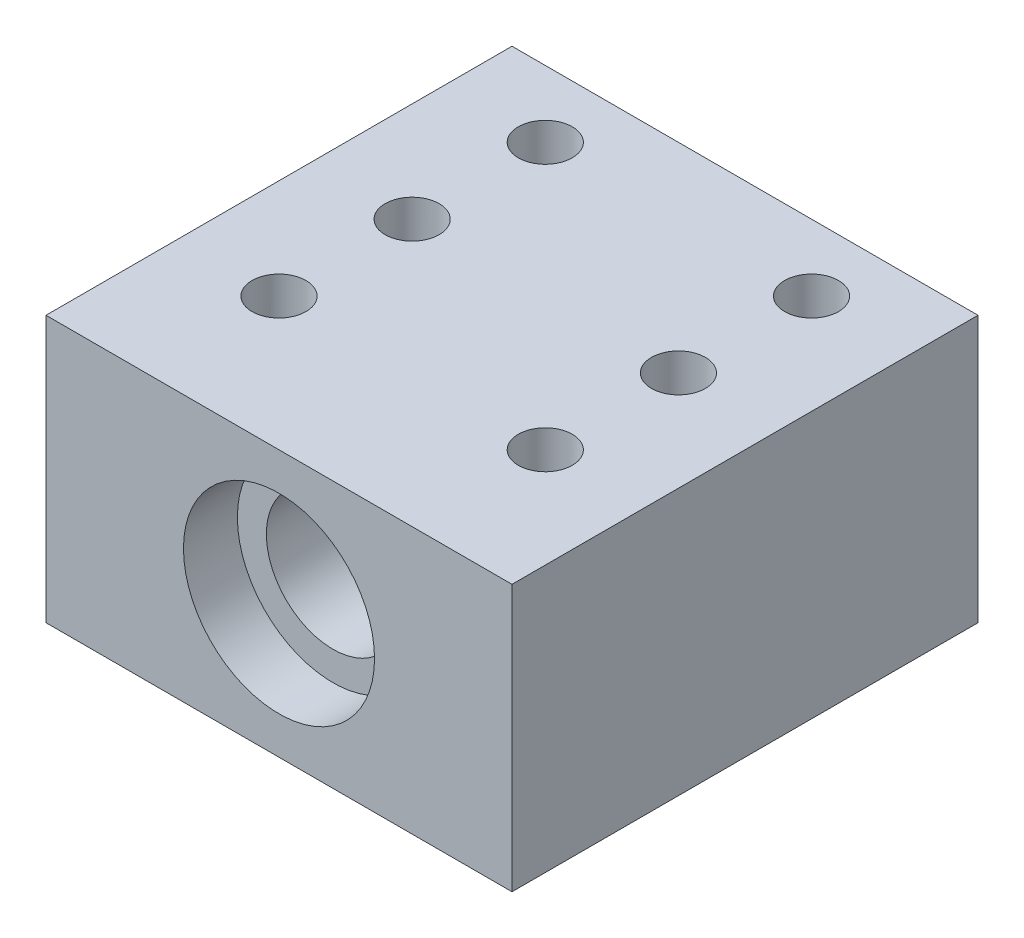
ISO-10303-21;
HEADER;
FILE_DESCRIPTION(('STEP AP214'),'2;1');
FILE_NAME('part.step','',(''),(''),'','','');
FILE_SCHEMA(('AUTOMOTIVE_DESIGN { 1 0 10303 214 1 1 1 1 }'));
ENDSEC;
DATA;
#1=APPLICATION_CONTEXT('core data for automotive mechanical design processes');
#2=APPLICATION_PROTOCOL_DEFINITION('international standard','automotive_design',2000,#1);
#3=PRODUCT_CONTEXT('',#1,'mechanical');
#4=PRODUCT('Part','Part','',(#3));
#5=PRODUCT_RELATED_PRODUCT_CATEGORY('part','',(#4));
#6=PRODUCT_DEFINITION_FORMATION('','',#4);
#7=PRODUCT_DEFINITION_CONTEXT('part definition',#1,'design');
#8=PRODUCT_DEFINITION('design','',#6,#7);
#9=PRODUCT_DEFINITION_SHAPE('','',#8);
#10=(LENGTH_UNIT() NAMED_UNIT(*) SI_UNIT(.MILLI.,.METRE.));
#11=(NAMED_UNIT(*) PLANE_ANGLE_UNIT() SI_UNIT($,.RADIAN.));
#12=(NAMED_UNIT(*) SI_UNIT($,.STERADIAN.) SOLID_ANGLE_UNIT());
#13=UNCERTAINTY_MEASURE_WITH_UNIT(LENGTH_MEASURE(1.E-05),#10,'distance_accuracy_value','');
#14=(GEOMETRIC_REPRESENTATION_CONTEXT(3) GLOBAL_UNCERTAINTY_ASSIGNED_CONTEXT((#13)) GLOBAL_UNIT_ASSIGNED_CONTEXT((#10,
#11,#12)) REPRESENTATION_CONTEXT('',''));
#15=CARTESIAN_POINT('',(0.,0.,0.));
#16=DIRECTION('',(0.,0.,1.));
#17=DIRECTION('',(1.,0.,0.));
#18=AXIS2_PLACEMENT_3D('',#15,#16,#17);
#19=CARTESIAN_POINT('',(0.,0.,40.));
#20=DIRECTION('',(0.,0.,-1.));
#21=DIRECTION('',(-1.,0.,0.));
#22=AXIS2_PLACEMENT_3D('',#19,#20,#21);
#23=CYLINDRICAL_SURFACE('',#22,10.);
#24=CARTESIAN_POINT('',(0.,0.,-21.9));
#25=DIRECTION('',(0.,0.,1.));
#26=DIRECTION('',(1.,0.,0.));
#27=AXIS2_PLACEMENT_3D('',#24,#25,#26);
#28=CIRCLE('',#27,10.);
#29=CARTESIAN_POINT('',(10.,0.,-21.9));
#30=VERTEX_POINT('',#29);
#31=EDGE_CURVE('E38',#30,#30,#28,.T.);
#32=ORIENTED_EDGE('',*,*,#31,.F.);
#33=EDGE_LOOP('',(#32));
#34=FACE_BOUND('',#33,.T.);
#35=CARTESIAN_POINT('',(0.,0.,31.9));
#36=DIRECTION('',(0.,0.,1.));
#37=DIRECTION('',(1.,0.,0.));
#38=AXIS2_PLACEMENT_3D('',#35,#36,#37);
#39=CIRCLE('',#38,10.);
#40=CARTESIAN_POINT('',(10.,0.,31.9));
#41=VERTEX_POINT('',#40);
#42=EDGE_CURVE('E118',#41,#41,#39,.T.);
#43=ORIENTED_EDGE('',*,*,#42,.T.);
#44=EDGE_LOOP('',(#43));
#45=FACE_BOUND('',#44,.T.);
#46=ADVANCED_FACE('F34',(#34,#45),#23,.F.);
#47=CARTESIAN_POINT('',(0.,0.,40.));
#48=DIRECTION('',(0.,0.,1.));
#49=DIRECTION('',(1.,0.,0.));
#50=AXIS2_PLACEMENT_3D('',#47,#48,#49);
#51=PLANE('',#50);
#52=CARTESIAN_POINT('',(0.,0.,40.));
#53=DIRECTION('',(0.,0.,1.));
#54=DIRECTION('',(1.,0.,0.));
#55=AXIS2_PLACEMENT_3D('',#52,#53,#54);
#56=CIRCLE('',#55,14.35);
#57=CARTESIAN_POINT('',(14.35,0.,40.));
#58=VERTEX_POINT('',#57);
#59=EDGE_CURVE('E141',#58,#58,#56,.T.);
#60=ORIENTED_EDGE('',*,*,#59,.F.);
#61=EDGE_LOOP('',(#60));
#62=FACE_BOUND('',#61,.T.);
#63=DIRECTION('',(0.,-1.,0.));
#64=VECTOR('',#63,1.);
#65=CARTESIAN_POINT('',(-35.,20.,40.));
#66=LINE('',#65,#64);
#67=CARTESIAN_POINT('',(-35.,20.,40.));
#68=VERTEX_POINT('',#67);
#69=CARTESIAN_POINT('',(-35.,-20.,40.));
#70=VERTEX_POINT('',#69);
#71=EDGE_CURVE('E105',#68,#70,#66,.T.);
#72=ORIENTED_EDGE('',*,*,#71,.T.);
#73=DIRECTION('',(1.,0.,0.));
#74=VECTOR('',#73,1.);
#75=CARTESIAN_POINT('',(-35.,-20.,40.));
#76=LINE('',#75,#74);
#77=CARTESIAN_POINT('',(35.,-20.,40.));
#78=VERTEX_POINT('',#77);
#79=EDGE_CURVE('E80',#70,#78,#76,.T.);
#80=ORIENTED_EDGE('',*,*,#79,.T.);
#81=DIRECTION('',(0.,1.,0.));
#82=VECTOR('',#81,1.);
#83=CARTESIAN_POINT('',(35.,20.,40.));
#84=LINE('',#83,#82);
#85=CARTESIAN_POINT('',(35.,20.,40.));
#86=VERTEX_POINT('',#85);
#87=EDGE_CURVE('E56',#78,#86,#84,.T.);
#88=ORIENTED_EDGE('',*,*,#87,.T.);
#89=DIRECTION('',(-1.,0.,0.));
#90=VECTOR('',#89,1.);
#91=CARTESIAN_POINT('',(-35.,20.,40.));
#92=LINE('',#91,#90);
#93=EDGE_CURVE('E51',#86,#68,#92,.T.);
#94=ORIENTED_EDGE('',*,*,#93,.T.);
#95=EDGE_LOOP('',(#72,#80,#88,#94));
#96=FACE_BOUND('',#95,.T.);
#97=ADVANCED_FACE('F192',(#62,#96),#51,.T.);
#98=CARTESIAN_POINT('',(-35.,20.,40.));
#99=DIRECTION('',(1.,0.,0.));
#100=DIRECTION('',(0.,1.,0.));
#101=AXIS2_PLACEMENT_3D('',#98,#99,#100);
#102=PLANE('',#101);
#103=DIRECTION('',(0.,0.,-1.));
#104=VECTOR('',#103,1.);
#105=CARTESIAN_POINT('',(-35.,20.,40.));
#106=LINE('',#105,#104);
#107=CARTESIAN_POINT('',(-35.,20.,-30.));
#108=VERTEX_POINT('',#107);
#109=EDGE_CURVE('E94',#68,#108,#106,.T.);
#110=ORIENTED_EDGE('',*,*,#109,.T.);
#111=DIRECTION('',(0.,-1.,0.));
#112=VECTOR('',#111,1.);
#113=CARTESIAN_POINT('',(-35.,20.,-30.));
#114=LINE('',#113,#112);
#115=CARTESIAN_POINT('',(-35.,-20.,-30.));
#116=VERTEX_POINT('',#115);
#117=EDGE_CURVE('E89',#108,#116,#114,.T.);
#118=ORIENTED_EDGE('',*,*,#117,.T.);
#119=DIRECTION('',(0.,0.,-1.));
#120=VECTOR('',#119,1.);
#121=CARTESIAN_POINT('',(-35.,-20.,40.));
#122=LINE('',#121,#120);
#123=EDGE_CURVE('E11',#70,#116,#122,.T.);
#124=ORIENTED_EDGE('',*,*,#123,.F.);
#125=ORIENTED_EDGE('',*,*,#71,.F.);
#126=EDGE_LOOP('',(#110,#118,#124,#125));
#127=FACE_BOUND('',#126,.T.);
#128=ADVANCED_FACE('F36',(#127),#102,.F.);
#129=CARTESIAN_POINT('',(-35.,-20.,40.));
#130=DIRECTION('',(0.,1.,0.));
#131=DIRECTION('',(-1.,0.,0.));
#132=AXIS2_PLACEMENT_3D('',#129,#130,#131);
#133=PLANE('',#132);
#134=CARTESIAN_POINT('',(-20.,-20.,0.));
#135=DIRECTION('',(0.,1.,0.));
#136=DIRECTION('',(-1.,0.,0.));
#137=AXIS2_PLACEMENT_3D('',#134,#135,#136);
#138=CIRCLE('',#137,4.05);
#139=CARTESIAN_POINT('',(-24.05,-20.,0.));
#140=VERTEX_POINT('',#139);
#141=EDGE_CURVE('E95',#140,#140,#138,.F.);
#142=ORIENTED_EDGE('',*,*,#141,.F.);
#143=EDGE_LOOP('',(#142));
#144=FACE_BOUND('',#143,.T.);
#145=CARTESIAN_POINT('',(20.,-20.,20.));
#146=DIRECTION('',(0.,1.,0.));
#147=DIRECTION('',(-1.,0.,0.));
#148=AXIS2_PLACEMENT_3D('',#145,#146,#147);
#149=CIRCLE('',#148,4.05);
#150=CARTESIAN_POINT('',(15.95,-20.,20.));
#151=VERTEX_POINT('',#150);
#152=EDGE_CURVE('E134',#151,#151,#149,.F.);
#153=ORIENTED_EDGE('',*,*,#152,.F.);
#154=EDGE_LOOP('',(#153));
#155=FACE_BOUND('',#154,.T.);
#156=CARTESIAN_POINT('',(-20.,-20.,20.));
#157=DIRECTION('',(0.,1.,0.));
#158=DIRECTION('',(-1.,0.,0.));
#159=AXIS2_PLACEMENT_3D('',#156,#157,#158);
#160=CIRCLE('',#159,4.05);
#161=CARTESIAN_POINT('',(-24.05,-20.,20.));
#162=VERTEX_POINT('',#161);
#163=EDGE_CURVE('E130',#162,#162,#160,.F.);
#164=ORIENTED_EDGE('',*,*,#163,.F.);
#165=EDGE_LOOP('',(#164));
#166=FACE_BOUND('',#165,.T.);
#167=CARTESIAN_POINT('',(20.,-20.,-20.));
#168=DIRECTION('',(0.,1.,0.));
#169=DIRECTION('',(-1.,0.,0.));
#170=AXIS2_PLACEMENT_3D('',#167,#168,#169);
#171=CIRCLE('',#170,4.05);
#172=CARTESIAN_POINT('',(15.95,-20.,-20.));
#173=VERTEX_POINT('',#172);
#174=EDGE_CURVE('E126',#173,#173,#171,.F.);
#175=ORIENTED_EDGE('',*,*,#174,.F.);
#176=EDGE_LOOP('',(#175));
#177=FACE_BOUND('',#176,.T.);
#178=CARTESIAN_POINT('',(20.,-20.,0.));
#179=DIRECTION('',(0.,1.,0.));
#180=DIRECTION('',(-1.,0.,0.));
#181=AXIS2_PLACEMENT_3D('',#178,#179,#180);
#182=CIRCLE('',#181,4.05);
#183=CARTESIAN_POINT('',(15.95,-20.,0.));
#184=VERTEX_POINT('',#183);
#185=EDGE_CURVE('E122',#184,#184,#182,.F.);
#186=ORIENTED_EDGE('',*,*,#185,.F.);
#187=EDGE_LOOP('',(#186));
#188=FACE_BOUND('',#187,.T.);
#189=CARTESIAN_POINT('',(-20.,-20.,-20.));
#190=DIRECTION('',(0.,1.,0.));
#191=DIRECTION('',(-1.,0.,0.));
#192=AXIS2_PLACEMENT_3D('',#189,#190,#191);
#193=CIRCLE('',#192,4.05);
#194=CARTESIAN_POINT('',(-24.05,-20.,-20.));
#195=VERTEX_POINT('',#194);
#196=EDGE_CURVE('E117',#195,#195,#193,.F.);
#197=ORIENTED_EDGE('',*,*,#196,.F.);
#198=EDGE_LOOP('',(#197));
#199=FACE_BOUND('',#198,.T.);
#200=ORIENTED_EDGE('',*,*,#123,.T.);
#201=DIRECTION('',(1.,0.,0.));
#202=VECTOR('',#201,1.);
#203=CARTESIAN_POINT('',(-35.,-20.,-30.));
#204=LINE('',#203,#202);
#205=CARTESIAN_POINT('',(35.,-20.,-30.));
#206=VERTEX_POINT('',#205);
#207=EDGE_CURVE('E79',#116,#206,#204,.T.);
#208=ORIENTED_EDGE('',*,*,#207,.T.);
#209=DIRECTION('',(0.,0.,-1.));
#210=VECTOR('',#209,1.);
#211=CARTESIAN_POINT('',(35.,-20.,40.));
#212=LINE('',#211,#210);
#213=EDGE_CURVE('E43',#78,#206,#212,.T.);
#214=ORIENTED_EDGE('',*,*,#213,.F.);
#215=ORIENTED_EDGE('',*,*,#79,.F.);
#216=EDGE_LOOP('',(#200,#208,#214,#215));
#217=FACE_BOUND('',#216,.T.);
#218=ADVANCED_FACE('F77',(#144,#155,#166,#177,#188,#199,#217),#133,.F.);
#219=CARTESIAN_POINT('',(35.,20.,40.));
#220=DIRECTION('',(-1.,0.,0.));
#221=DIRECTION('',(0.,-1.,0.));
#222=AXIS2_PLACEMENT_3D('',#219,#220,#221);
#223=PLANE('',#222);
#224=ORIENTED_EDGE('',*,*,#213,.T.);
#225=DIRECTION('',(0.,1.,0.));
#226=VECTOR('',#225,1.);
#227=CARTESIAN_POINT('',(35.,20.,-30.));
#228=LINE('',#227,#226);
#229=CARTESIAN_POINT('',(35.,20.,-30.));
#230=VERTEX_POINT('',#229);
#231=EDGE_CURVE('E92',#206,#230,#228,.T.);
#232=ORIENTED_EDGE('',*,*,#231,.T.);
#233=DIRECTION('',(0.,0.,-1.));
#234=VECTOR('',#233,1.);
#235=CARTESIAN_POINT('',(35.,20.,40.));
#236=LINE('',#235,#234);
#237=EDGE_CURVE('E111',#86,#230,#236,.T.);
#238=ORIENTED_EDGE('',*,*,#237,.F.);
#239=ORIENTED_EDGE('',*,*,#87,.F.);
#240=EDGE_LOOP('',(#224,#232,#238,#239));
#241=FACE_BOUND('',#240,.T.);
#242=ADVANCED_FACE('F165',(#241),#223,.F.);
#243=CARTESIAN_POINT('',(-35.,20.,40.));
#244=DIRECTION('',(0.,-1.,0.));
#245=DIRECTION('',(1.,0.,0.));
#246=AXIS2_PLACEMENT_3D('',#243,#244,#245);
#247=PLANE('',#246);
#248=CARTESIAN_POINT('',(-20.,20.,0.));
#249=DIRECTION('',(0.,-1.,0.));
#250=DIRECTION('',(1.,0.,0.));
#251=AXIS2_PLACEMENT_3D('',#248,#249,#250);
#252=CIRCLE('',#251,4.05);
#253=CARTESIAN_POINT('',(-15.95,20.,0.));
#254=VERTEX_POINT('',#253);
#255=EDGE_CURVE('E98',#254,#254,#252,.F.);
#256=ORIENTED_EDGE('',*,*,#255,.F.);
#257=EDGE_LOOP('',(#256));
#258=FACE_BOUND('',#257,.T.);
#259=CARTESIAN_POINT('',(20.,20.,20.));
#260=DIRECTION('',(0.,-1.,0.));
#261=DIRECTION('',(1.,0.,0.));
#262=AXIS2_PLACEMENT_3D('',#259,#260,#261);
#263=CIRCLE('',#262,4.05);
#264=CARTESIAN_POINT('',(24.05,20.,20.));
#265=VERTEX_POINT('',#264);
#266=EDGE_CURVE('E131',#265,#265,#263,.F.);
#267=ORIENTED_EDGE('',*,*,#266,.F.);
#268=EDGE_LOOP('',(#267));
#269=FACE_BOUND('',#268,.T.);
#270=CARTESIAN_POINT('',(-20.,20.,20.));
#271=DIRECTION('',(0.,-1.,0.));
#272=DIRECTION('',(1.,0.,0.));
#273=AXIS2_PLACEMENT_3D('',#270,#271,#272);
#274=CIRCLE('',#273,4.05);
#275=CARTESIAN_POINT('',(-15.95,20.,20.));
#276=VERTEX_POINT('',#275);
#277=EDGE_CURVE('E127',#276,#276,#274,.F.);
#278=ORIENTED_EDGE('',*,*,#277,.F.);
#279=EDGE_LOOP('',(#278));
#280=FACE_BOUND('',#279,.T.);
#281=CARTESIAN_POINT('',(20.,20.,-20.));
#282=DIRECTION('',(0.,-1.,0.));
#283=DIRECTION('',(1.,0.,0.));
#284=AXIS2_PLACEMENT_3D('',#281,#282,#283);
#285=CIRCLE('',#284,4.05);
#286=CARTESIAN_POINT('',(24.05,20.,-20.));
#287=VERTEX_POINT('',#286);
#288=EDGE_CURVE('E123',#287,#287,#285,.F.);
#289=ORIENTED_EDGE('',*,*,#288,.F.);
#290=EDGE_LOOP('',(#289));
#291=FACE_BOUND('',#290,.T.);
#292=CARTESIAN_POINT('',(20.,20.,0.));
#293=DIRECTION('',(0.,-1.,0.));
#294=DIRECTION('',(1.,0.,0.));
#295=AXIS2_PLACEMENT_3D('',#292,#293,#294);
#296=CIRCLE('',#295,4.05);
#297=CARTESIAN_POINT('',(24.05,20.,0.));
#298=VERTEX_POINT('',#297);
#299=EDGE_CURVE('E119',#298,#298,#296,.F.);
#300=ORIENTED_EDGE('',*,*,#299,.F.);
#301=EDGE_LOOP('',(#300));
#302=FACE_BOUND('',#301,.T.);
#303=CARTESIAN_POINT('',(-20.,20.,-20.));
#304=DIRECTION('',(0.,-1.,0.));
#305=DIRECTION('',(1.,0.,0.));
#306=AXIS2_PLACEMENT_3D('',#303,#304,#305);
#307=CIRCLE('',#306,4.05);
#308=CARTESIAN_POINT('',(-15.95,20.,-20.));
#309=VERTEX_POINT('',#308);
#310=EDGE_CURVE('E114',#309,#309,#307,.F.);
#311=ORIENTED_EDGE('',*,*,#310,.F.);
#312=EDGE_LOOP('',(#311));
#313=FACE_BOUND('',#312,.T.);
#314=ORIENTED_EDGE('',*,*,#237,.T.);
#315=DIRECTION('',(-1.,0.,0.));
#316=VECTOR('',#315,1.);
#317=CARTESIAN_POINT('',(-35.,20.,-30.));
#318=LINE('',#317,#316);
#319=EDGE_CURVE('E103',#230,#108,#318,.T.);
#320=ORIENTED_EDGE('',*,*,#319,.T.);
#321=ORIENTED_EDGE('',*,*,#109,.F.);
#322=ORIENTED_EDGE('',*,*,#93,.F.);
#323=EDGE_LOOP('',(#314,#320,#321,#322));
#324=FACE_BOUND('',#323,.T.);
#325=ADVANCED_FACE('F187',(#258,#269,#280,#291,#302,#313,#324),#247,.F.);
#326=CARTESIAN_POINT('',(0.,0.,-30.));
#327=DIRECTION('',(0.,0.,1.));
#328=DIRECTION('',(1.,0.,0.));
#329=AXIS2_PLACEMENT_3D('',#326,#327,#328);
#330=PLANE('',#329);
#331=CARTESIAN_POINT('',(0.,0.,-30.));
#332=DIRECTION('',(0.,0.,1.));
#333=DIRECTION('',(1.,0.,0.));
#334=AXIS2_PLACEMENT_3D('',#331,#332,#333);
#335=CIRCLE('',#334,14.2875);
#336=CARTESIAN_POINT('',(14.2875,0.,-30.));
#337=VERTEX_POINT('',#336);
#338=EDGE_CURVE('E148',#337,#337,#335,.T.);
#339=ORIENTED_EDGE('',*,*,#338,.T.);
#340=EDGE_LOOP('',(#339));
#341=FACE_BOUND('',#340,.T.);
#342=ORIENTED_EDGE('',*,*,#117,.F.);
#343=ORIENTED_EDGE('',*,*,#319,.F.);
#344=ORIENTED_EDGE('',*,*,#231,.F.);
#345=ORIENTED_EDGE('',*,*,#207,.F.);
#346=EDGE_LOOP('',(#342,#343,#344,#345));
#347=FACE_BOUND('',#346,.T.);
#348=ADVANCED_FACE('F87',(#341,#347),#330,.F.);
#349=CARTESIAN_POINT('',(-20.,25.,-20.));
#350=DIRECTION('',(0.,-1.,0.));
#351=DIRECTION('',(0.,0.,-1.));
#352=AXIS2_PLACEMENT_3D('',#349,#350,#351);
#353=CYLINDRICAL_SURFACE('',#352,4.05);
#354=ORIENTED_EDGE('',*,*,#310,.T.);
#355=EDGE_LOOP('',(#354));
#356=FACE_BOUND('',#355,.T.);
#357=ORIENTED_EDGE('',*,*,#196,.T.);
#358=EDGE_LOOP('',(#357));
#359=FACE_BOUND('',#358,.T.);
#360=ADVANCED_FACE('F175',(#356,#359),#353,.F.);
#361=CARTESIAN_POINT('',(20.,25.,0.));
#362=DIRECTION('',(0.,-1.,0.));
#363=DIRECTION('',(0.,0.,-1.));
#364=AXIS2_PLACEMENT_3D('',#361,#362,#363);
#365=CYLINDRICAL_SURFACE('',#364,4.05);
#366=ORIENTED_EDGE('',*,*,#299,.T.);
#367=EDGE_LOOP('',(#366));
#368=FACE_BOUND('',#367,.T.);
#369=ORIENTED_EDGE('',*,*,#185,.T.);
#370=EDGE_LOOP('',(#369));
#371=FACE_BOUND('',#370,.T.);
#372=ADVANCED_FACE('F177',(#368,#371),#365,.F.);
#373=CARTESIAN_POINT('',(20.,25.,-20.));
#374=DIRECTION('',(0.,-1.,0.));
#375=DIRECTION('',(0.,0.,-1.));
#376=AXIS2_PLACEMENT_3D('',#373,#374,#375);
#377=CYLINDRICAL_SURFACE('',#376,4.05);
#378=ORIENTED_EDGE('',*,*,#288,.T.);
#379=EDGE_LOOP('',(#378));
#380=FACE_BOUND('',#379,.T.);
#381=ORIENTED_EDGE('',*,*,#174,.T.);
#382=EDGE_LOOP('',(#381));
#383=FACE_BOUND('',#382,.T.);
#384=ADVANCED_FACE('F184',(#380,#383),#377,.F.);
#385=CARTESIAN_POINT('',(-20.,25.,20.));
#386=DIRECTION('',(0.,-1.,0.));
#387=DIRECTION('',(0.,0.,-1.));
#388=AXIS2_PLACEMENT_3D('',#385,#386,#387);
#389=CYLINDRICAL_SURFACE('',#388,4.05);
#390=ORIENTED_EDGE('',*,*,#277,.T.);
#391=EDGE_LOOP('',(#390));
#392=FACE_BOUND('',#391,.T.);
#393=ORIENTED_EDGE('',*,*,#163,.T.);
#394=EDGE_LOOP('',(#393));
#395=FACE_BOUND('',#394,.T.);
#396=ADVANCED_FACE('F265',(#392,#395),#389,.F.);
#397=CARTESIAN_POINT('',(20.,25.,20.));
#398=DIRECTION('',(0.,-1.,0.));
#399=DIRECTION('',(0.,0.,-1.));
#400=AXIS2_PLACEMENT_3D('',#397,#398,#399);
#401=CYLINDRICAL_SURFACE('',#400,4.05);
#402=ORIENTED_EDGE('',*,*,#266,.T.);
#403=EDGE_LOOP('',(#402));
#404=FACE_BOUND('',#403,.T.);
#405=ORIENTED_EDGE('',*,*,#152,.T.);
#406=EDGE_LOOP('',(#405));
#407=FACE_BOUND('',#406,.T.);
#408=ADVANCED_FACE('F161',(#404,#407),#401,.F.);
#409=CARTESIAN_POINT('',(-20.,25.,0.));
#410=DIRECTION('',(0.,-1.,0.));
#411=DIRECTION('',(0.,0.,-1.));
#412=AXIS2_PLACEMENT_3D('',#409,#410,#411);
#413=CYLINDRICAL_SURFACE('',#412,4.05);
#414=ORIENTED_EDGE('',*,*,#255,.T.);
#415=EDGE_LOOP('',(#414));
#416=FACE_BOUND('',#415,.T.);
#417=ORIENTED_EDGE('',*,*,#141,.T.);
#418=EDGE_LOOP('',(#417));
#419=FACE_BOUND('',#418,.T.);
#420=ADVANCED_FACE('F260',(#416,#419),#413,.F.);
#421=CARTESIAN_POINT('',(0.,0.,31.9));
#422=DIRECTION('',(0.,0.,1.));
#423=DIRECTION('',(1.,0.,0.));
#424=AXIS2_PLACEMENT_3D('',#421,#422,#423);
#425=CYLINDRICAL_SURFACE('',#424,14.35);
#426=CARTESIAN_POINT('',(0.,0.,31.9));
#427=DIRECTION('',(0.,0.,1.));
#428=DIRECTION('',(1.,0.,0.));
#429=AXIS2_PLACEMENT_3D('',#426,#427,#428);
#430=CIRCLE('',#429,14.35);
#431=CARTESIAN_POINT('',(14.35,0.,31.9));
#432=VERTEX_POINT('',#431);
#433=EDGE_CURVE('E137',#432,#432,#430,.T.);
#434=ORIENTED_EDGE('',*,*,#433,.F.);
#435=EDGE_LOOP('',(#434));
#436=FACE_BOUND('',#435,.T.);
#437=ORIENTED_EDGE('',*,*,#59,.T.);
#438=EDGE_LOOP('',(#437));
#439=FACE_BOUND('',#438,.T.);
#440=ADVANCED_FACE('F257',(#436,#439),#425,.F.);
#441=CARTESIAN_POINT('',(0.,0.,31.9));
#442=DIRECTION('',(0.,0.,1.));
#443=DIRECTION('',(1.,0.,0.));
#444=AXIS2_PLACEMENT_3D('',#441,#442,#443);
#445=PLANE('',#444);
#446=ORIENTED_EDGE('',*,*,#42,.F.);
#447=EDGE_LOOP('',(#446));
#448=FACE_BOUND('',#447,.T.);
#449=ORIENTED_EDGE('',*,*,#433,.T.);
#450=EDGE_LOOP('',(#449));
#451=FACE_BOUND('',#450,.T.);
#452=ADVANCED_FACE('F237',(#448,#451),#445,.T.);
#453=CARTESIAN_POINT('',(0.,0.,-21.9));
#454=DIRECTION('',(0.,0.,-1.));
#455=DIRECTION('',(-1.,0.,0.));
#456=AXIS2_PLACEMENT_3D('',#453,#454,#455);
#457=CYLINDRICAL_SURFACE('',#456,14.2875);
#458=CARTESIAN_POINT('',(0.,0.,-21.9));
#459=DIRECTION('',(0.,0.,1.));
#460=DIRECTION('',(1.,0.,0.));
#461=AXIS2_PLACEMENT_3D('',#458,#459,#460);
#462=CIRCLE('',#461,14.2875);
#463=CARTESIAN_POINT('',(14.2875,0.,-21.9));
#464=VERTEX_POINT('',#463);
#465=EDGE_CURVE('E358',#464,#464,#462,.T.);
#466=ORIENTED_EDGE('',*,*,#465,.T.);
#467=EDGE_LOOP('',(#466));
#468=FACE_BOUND('',#467,.T.);
#469=ORIENTED_EDGE('',*,*,#338,.F.);
#470=EDGE_LOOP('',(#469));
#471=FACE_BOUND('',#470,.T.);
#472=ADVANCED_FACE('F231',(#468,#471),#457,.F.);
#473=CARTESIAN_POINT('',(0.,0.,-21.9));
#474=DIRECTION('',(0.,0.,1.));
#475=DIRECTION('',(1.,0.,0.));
#476=AXIS2_PLACEMENT_3D('',#473,#474,#475);
#477=PLANE('',#476);
#478=ORIENTED_EDGE('',*,*,#31,.T.);
#479=EDGE_LOOP('',(#478));
#480=FACE_BOUND('',#479,.T.);
#481=ORIENTED_EDGE('',*,*,#465,.F.);
#482=EDGE_LOOP('',(#481));
#483=FACE_BOUND('',#482,.T.);
#484=ADVANCED_FACE('F236',(#480,#483),#477,.F.);
#485=CLOSED_SHELL('',(#46,#97,#128,#218,#242,#325,#348,#360,#372,#384,#396,#408,#420,#440,#452,
#472,#484));
#486=MANIFOLD_SOLID_BREP('B2',#485);
#487=ADVANCED_BREP_SHAPE_REPRESENTATION('',(#18,#486),#14);
#488=SHAPE_DEFINITION_REPRESENTATION(#9,#487);
ENDSEC;
END-ISO-10303-21;
